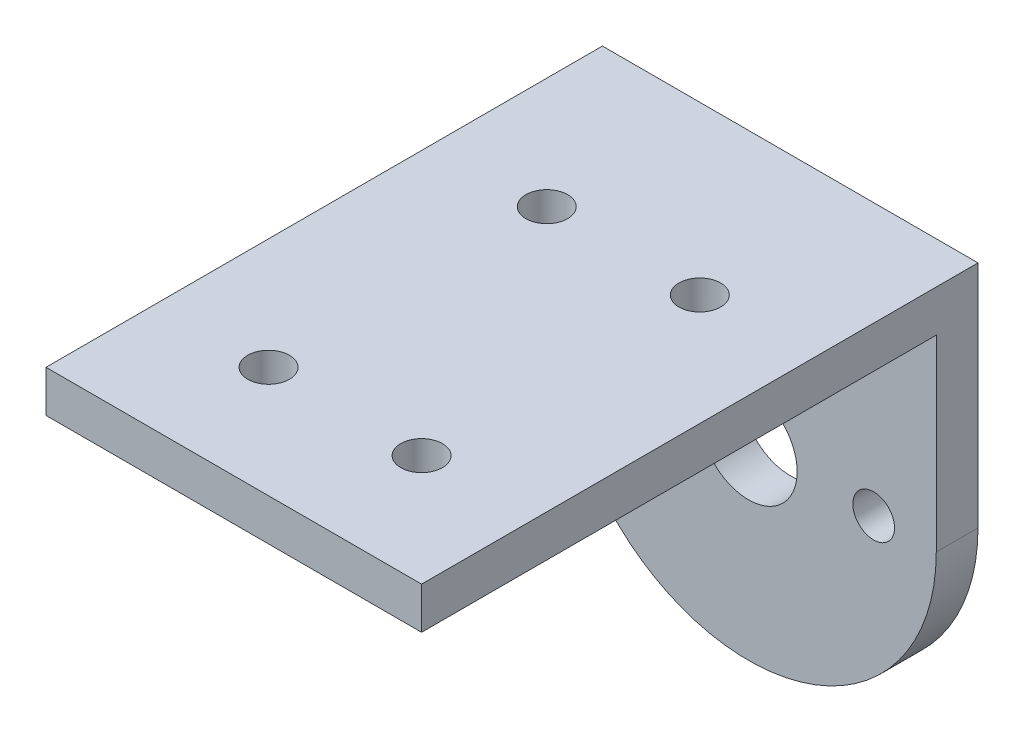
ISO-10303-21;
HEADER;
FILE_DESCRIPTION(('STEP AP214'),'2;1');
FILE_NAME('part.step','',(''),(''),'','','');
FILE_SCHEMA(('AUTOMOTIVE_DESIGN { 1 0 10303 214 1 1 1 1 }'));
ENDSEC;
DATA;
#1=APPLICATION_CONTEXT('core data for automotive mechanical design processes');
#2=APPLICATION_PROTOCOL_DEFINITION('international standard','automotive_design',2000,#1);
#3=PRODUCT_CONTEXT('',#1,'mechanical');
#4=PRODUCT('Part','Part','',(#3));
#5=PRODUCT_RELATED_PRODUCT_CATEGORY('part','',(#4));
#6=PRODUCT_DEFINITION_FORMATION('','',#4);
#7=PRODUCT_DEFINITION_CONTEXT('part definition',#1,'design');
#8=PRODUCT_DEFINITION('design','',#6,#7);
#9=PRODUCT_DEFINITION_SHAPE('','',#8);
#10=(LENGTH_UNIT() NAMED_UNIT(*) SI_UNIT(.MILLI.,.METRE.));
#11=(NAMED_UNIT(*) PLANE_ANGLE_UNIT() SI_UNIT($,.RADIAN.));
#12=(NAMED_UNIT(*) SI_UNIT($,.STERADIAN.) SOLID_ANGLE_UNIT());
#13=UNCERTAINTY_MEASURE_WITH_UNIT(LENGTH_MEASURE(1.E-05),#10,'distance_accuracy_value','');
#14=(GEOMETRIC_REPRESENTATION_CONTEXT(3) GLOBAL_UNCERTAINTY_ASSIGNED_CONTEXT((#13)) GLOBAL_UNIT_ASSIGNED_CONTEXT((#10,
#11,#12)) REPRESENTATION_CONTEXT('',''));
#15=CARTESIAN_POINT('',(0.,0.,0.));
#16=DIRECTION('',(0.,0.,1.));
#17=DIRECTION('',(1.,0.,0.));
#18=AXIS2_PLACEMENT_3D('',#15,#16,#17);
#19=CARTESIAN_POINT('',(2606.26671450499,1592.8264256332,40.));
#20=DIRECTION('',(0.,0.,1.));
#21=DIRECTION('',(1.,0.,0.));
#22=AXIS2_PLACEMENT_3D('',#19,#20,#21);
#23=PLANE('',#22);
#24=DIRECTION('',(1.,0.,0.));
#25=VECTOR('',#24,1.);
#26=CARTESIAN_POINT('',(2582.98867960901,1606.3264256332,40.));
#27=LINE('',#26,#25);
#28=CARTESIAN_POINT('',(2592.76671450499,1606.3264256332,40.));
#29=VERTEX_POINT('',#28);
#30=CARTESIAN_POINT('',(2619.76671450502,1606.3264256332,40.));
#31=VERTEX_POINT('',#30);
#32=EDGE_CURVE('E133',#29,#31,#27,.T.);
#33=ORIENTED_EDGE('',*,*,#32,.T.);
#34=DIRECTION('',(0.,1.,0.));
#35=VECTOR('',#34,1.);
#36=CARTESIAN_POINT('',(2619.76671450499,1592.8264256332,40.));
#37=LINE('',#36,#35);
#38=CARTESIAN_POINT('',(2619.76671450499,1609.3264256332,40.));
#39=VERTEX_POINT('',#38);
#40=EDGE_CURVE('E109',#31,#39,#37,.T.);
#41=ORIENTED_EDGE('',*,*,#40,.T.);
#42=DIRECTION('',(-1.,0.,0.));
#43=VECTOR('',#42,1.);
#44=CARTESIAN_POINT('',(2592.76671450499,1609.3264256332,40.));
#45=LINE('',#44,#43);
#46=CARTESIAN_POINT('',(2592.76671450499,1609.3264256332,40.));
#47=VERTEX_POINT('',#46);
#48=EDGE_CURVE('E69',#39,#47,#45,.T.);
#49=ORIENTED_EDGE('',*,*,#48,.T.);
#50=DIRECTION('',(0.,-1.,0.));
#51=VECTOR('',#50,1.);
#52=CARTESIAN_POINT('',(2592.76671450499,1592.8264256332,40.));
#53=LINE('',#52,#51);
#54=EDGE_CURVE('E100',#47,#29,#53,.T.);
#55=ORIENTED_EDGE('',*,*,#54,.T.);
#56=EDGE_LOOP('',(#33,#41,#49,#55));
#57=FACE_BOUND('',#56,.T.);
#58=ADVANCED_FACE('F43',(#57),#23,.T.);
#59=CARTESIAN_POINT('',(2606.26671450499,1592.8264256332,0.));
#60=DIRECTION('',(0.,0.,1.));
#61=DIRECTION('',(1.,0.,0.));
#62=AXIS2_PLACEMENT_3D('',#59,#60,#61);
#63=PLANE('',#62);
#64=CARTESIAN_POINT('',(2597.26671450499,1592.8264256332,0.));
#65=DIRECTION('',(0.,0.,-1.));
#66=DIRECTION('',(-1.,0.,0.));
#67=AXIS2_PLACEMENT_3D('',#64,#65,#66);
#68=CIRCLE('',#67,1.50000000000011);
#69=CARTESIAN_POINT('',(2595.76671450499,1592.8264256332,0.));
#70=VERTEX_POINT('',#69);
#71=EDGE_CURVE('E153',#70,#70,#68,.T.);
#72=ORIENTED_EDGE('',*,*,#71,.F.);
#73=EDGE_LOOP('',(#72));
#74=FACE_BOUND('',#73,.T.);
#75=CARTESIAN_POINT('',(2615.26671450499,1592.8264256332,0.));
#76=DIRECTION('',(0.,0.,-1.));
#77=DIRECTION('',(-1.,0.,0.));
#78=AXIS2_PLACEMENT_3D('',#75,#76,#77);
#79=CIRCLE('',#78,1.50000000000011);
#80=CARTESIAN_POINT('',(2613.76671450499,1592.8264256332,0.));
#81=VERTEX_POINT('',#80);
#82=EDGE_CURVE('E158',#81,#81,#79,.T.);
#83=ORIENTED_EDGE('',*,*,#82,.F.);
#84=EDGE_LOOP('',(#83));
#85=FACE_BOUND('',#84,.T.);
#86=CARTESIAN_POINT('',(2606.26671450499,1592.8264256332,0.));
#87=DIRECTION('',(0.,0.,1.));
#88=DIRECTION('',(1.,0.,0.));
#89=AXIS2_PLACEMENT_3D('',#86,#87,#88);
#90=CIRCLE('',#89,13.5000000000001);
#91=CARTESIAN_POINT('',(2592.76671450499,1592.8264256332,0.));
#92=VERTEX_POINT('',#91);
#93=CARTESIAN_POINT('',(2619.76671450499,1592.8264256332,0.));
#94=VERTEX_POINT('',#93);
#95=EDGE_CURVE('E93',#92,#94,#90,.T.);
#96=ORIENTED_EDGE('',*,*,#95,.F.);
#97=DIRECTION('',(0.,-1.,0.));
#98=VECTOR('',#97,1.);
#99=CARTESIAN_POINT('',(2592.76671450499,1592.8264256332,0.));
#100=LINE('',#99,#98);
#101=CARTESIAN_POINT('',(2592.76671450499,1609.3264256332,0.));
#102=VERTEX_POINT('',#101);
#103=EDGE_CURVE('E104',#102,#92,#100,.T.);
#104=ORIENTED_EDGE('',*,*,#103,.F.);
#105=DIRECTION('',(-1.,0.,0.));
#106=VECTOR('',#105,1.);
#107=CARTESIAN_POINT('',(2592.76671450499,1609.3264256332,0.));
#108=LINE('',#107,#106);
#109=CARTESIAN_POINT('',(2619.76671450499,1609.3264256332,0.));
#110=VERTEX_POINT('',#109);
#111=EDGE_CURVE('E110',#110,#102,#108,.T.);
#112=ORIENTED_EDGE('',*,*,#111,.F.);
#113=DIRECTION('',(0.,1.,0.));
#114=VECTOR('',#113,1.);
#115=CARTESIAN_POINT('',(2619.76671450499,1592.8264256332,0.));
#116=LINE('',#115,#114);
#117=EDGE_CURVE('E115',#94,#110,#116,.T.);
#118=ORIENTED_EDGE('',*,*,#117,.F.);
#119=EDGE_LOOP('',(#96,#104,#112,#118));
#120=FACE_BOUND('',#119,.T.);
#121=CARTESIAN_POINT('',(2606.26671450499,1592.8264256332,0.));
#122=DIRECTION('',(0.,0.,1.));
#123=DIRECTION('',(1.,0.,0.));
#124=AXIS2_PLACEMENT_3D('',#121,#122,#123);
#125=CIRCLE('',#124,3.49999999999984);
#126=CARTESIAN_POINT('',(2609.76671450499,1592.8264256332,0.));
#127=VERTEX_POINT('',#126);
#128=EDGE_CURVE('E116',#127,#127,#125,.T.);
#129=ORIENTED_EDGE('',*,*,#128,.T.);
#130=EDGE_LOOP('',(#129));
#131=FACE_BOUND('',#130,.T.);
#132=ADVANCED_FACE('F113',(#74,#85,#120,#131),#63,.F.);
#133=CARTESIAN_POINT('',(2606.26671450499,1592.8264256332,40.));
#134=DIRECTION('',(0.,0.,-1.));
#135=DIRECTION('',(-1.,0.,0.));
#136=AXIS2_PLACEMENT_3D('',#133,#134,#135);
#137=CYLINDRICAL_SURFACE('',#136,13.5000000000001);
#138=DIRECTION('',(0.,0.,-1.));
#139=VECTOR('',#138,1.);
#140=CARTESIAN_POINT('',(2619.76671450499,1592.8264256332,40.));
#141=LINE('',#140,#139);
#142=CARTESIAN_POINT('',(2619.76671450502,1592.8264256332,3.));
#143=VERTEX_POINT('',#142);
#144=EDGE_CURVE('E52',#143,#94,#141,.T.);
#145=ORIENTED_EDGE('',*,*,#144,.F.);
#146=CARTESIAN_POINT('',(2606.26671450499,1592.8264256332,3.));
#147=DIRECTION('',(0.,0.,-1.));
#148=DIRECTION('',(0.,1.,0.));
#149=AXIS2_PLACEMENT_3D('',#146,#147,#148);
#150=CIRCLE('',#149,13.5000000000001);
#151=CARTESIAN_POINT('',(2592.76671450499,1592.8264256332,3.));
#152=VERTEX_POINT('',#151);
#153=EDGE_CURVE('E96',#143,#152,#150,.T.);
#154=ORIENTED_EDGE('',*,*,#153,.T.);
#155=DIRECTION('',(0.,0.,-1.));
#156=VECTOR('',#155,1.);
#157=CARTESIAN_POINT('',(2592.76671450499,1592.8264256332,40.));
#158=LINE('',#157,#156);
#159=EDGE_CURVE('E89',#152,#92,#158,.T.);
#160=ORIENTED_EDGE('',*,*,#159,.T.);
#161=ORIENTED_EDGE('',*,*,#95,.T.);
#162=EDGE_LOOP('',(#145,#154,#160,#161));
#163=FACE_BOUND('',#162,.T.);
#164=ADVANCED_FACE('F45',(#163),#137,.T.);
#165=CARTESIAN_POINT('',(2619.76671450499,1592.8264256332,40.));
#166=DIRECTION('',(-1.,0.,0.));
#167=DIRECTION('',(0.,0.,1.));
#168=AXIS2_PLACEMENT_3D('',#165,#166,#167);
#169=PLANE('',#168);
#170=ORIENTED_EDGE('',*,*,#40,.F.);
#171=DIRECTION('',(0.,0.,1.));
#172=VECTOR('',#171,1.);
#173=CARTESIAN_POINT('',(2619.76671450502,1606.3264256332,40.));
#174=LINE('',#173,#172);
#175=CARTESIAN_POINT('',(2619.76671450502,1606.3264256332,3.));
#176=VERTEX_POINT('',#175);
#177=EDGE_CURVE('E174',#176,#31,#174,.T.);
#178=ORIENTED_EDGE('',*,*,#177,.F.);
#179=DIRECTION('',(0.,1.,0.));
#180=VECTOR('',#179,1.);
#181=CARTESIAN_POINT('',(2619.76671450502,1606.3264256332,3.));
#182=LINE('',#181,#180);
#183=EDGE_CURVE('E138',#143,#176,#182,.T.);
#184=ORIENTED_EDGE('',*,*,#183,.F.);
#185=ORIENTED_EDGE('',*,*,#144,.T.);
#186=ORIENTED_EDGE('',*,*,#117,.T.);
#187=DIRECTION('',(0.,0.,-1.));
#188=VECTOR('',#187,1.);
#189=CARTESIAN_POINT('',(2619.76671450499,1609.3264256332,40.));
#190=LINE('',#189,#188);
#191=EDGE_CURVE('E126',#39,#110,#190,.T.);
#192=ORIENTED_EDGE('',*,*,#191,.F.);
#193=EDGE_LOOP('',(#170,#178,#184,#185,#186,#192));
#194=FACE_BOUND('',#193,.T.);
#195=ADVANCED_FACE('F193',(#194),#169,.F.);
#196=CARTESIAN_POINT('',(2592.76671450499,1609.3264256332,40.));
#197=DIRECTION('',(0.,-1.,0.));
#198=DIRECTION('',(0.,0.,-1.));
#199=AXIS2_PLACEMENT_3D('',#196,#197,#198);
#200=PLANE('',#199);
#201=CARTESIAN_POINT('',(2600.76671450499,1609.3264256332,12.));
#202=DIRECTION('',(0.,1.,0.));
#203=DIRECTION('',(0.,0.,1.));
#204=AXIS2_PLACEMENT_3D('',#201,#202,#203);
#205=CIRCLE('',#204,1.50000000000008);
#206=CARTESIAN_POINT('',(2600.76671450499,1609.3264256332,13.5000000000001));
#207=VERTEX_POINT('',#206);
#208=EDGE_CURVE('E150',#207,#207,#205,.T.);
#209=ORIENTED_EDGE('',*,*,#208,.F.);
#210=EDGE_LOOP('',(#209));
#211=FACE_BOUND('',#210,.T.);
#212=CARTESIAN_POINT('',(2611.76671450499,1609.3264256332,12.));
#213=DIRECTION('',(0.,1.,0.));
#214=DIRECTION('',(0.,0.,1.));
#215=AXIS2_PLACEMENT_3D('',#212,#213,#214);
#216=CIRCLE('',#215,1.50000000000008);
#217=CARTESIAN_POINT('',(2611.76671450499,1609.3264256332,13.5000000000001));
#218=VERTEX_POINT('',#217);
#219=EDGE_CURVE('E147',#218,#218,#216,.T.);
#220=ORIENTED_EDGE('',*,*,#219,.F.);
#221=EDGE_LOOP('',(#220));
#222=FACE_BOUND('',#221,.T.);
#223=CARTESIAN_POINT('',(2611.76671450499,1609.3264256332,32.));
#224=DIRECTION('',(0.,1.,0.));
#225=DIRECTION('',(0.,0.,1.));
#226=AXIS2_PLACEMENT_3D('',#223,#224,#225);
#227=CIRCLE('',#226,1.50000000000008);
#228=CARTESIAN_POINT('',(2611.76671450499,1609.3264256332,33.5000000000001));
#229=VERTEX_POINT('',#228);
#230=EDGE_CURVE('E143',#229,#229,#227,.T.);
#231=ORIENTED_EDGE('',*,*,#230,.F.);
#232=EDGE_LOOP('',(#231));
#233=FACE_BOUND('',#232,.T.);
#234=CARTESIAN_POINT('',(2600.76671450499,1609.3264256332,32.));
#235=DIRECTION('',(0.,1.,0.));
#236=DIRECTION('',(0.,0.,1.));
#237=AXIS2_PLACEMENT_3D('',#234,#235,#236);
#238=CIRCLE('',#237,1.50000000000008);
#239=CARTESIAN_POINT('',(2600.76671450499,1609.3264256332,33.5000000000001));
#240=VERTEX_POINT('',#239);
#241=EDGE_CURVE('E139',#240,#240,#238,.T.);
#242=ORIENTED_EDGE('',*,*,#241,.F.);
#243=EDGE_LOOP('',(#242));
#244=FACE_BOUND('',#243,.T.);
#245=ORIENTED_EDGE('',*,*,#111,.T.);
#246=DIRECTION('',(0.,0.,-1.));
#247=VECTOR('',#246,1.);
#248=CARTESIAN_POINT('',(2592.76671450499,1609.3264256332,40.));
#249=LINE('',#248,#247);
#250=EDGE_CURVE('E99',#47,#102,#249,.T.);
#251=ORIENTED_EDGE('',*,*,#250,.F.);
#252=ORIENTED_EDGE('',*,*,#48,.F.);
#253=ORIENTED_EDGE('',*,*,#191,.T.);
#254=EDGE_LOOP('',(#245,#251,#252,#253));
#255=FACE_BOUND('',#254,.T.);
#256=ADVANCED_FACE('F226',(#211,#222,#233,#244,#255),#200,.F.);
#257=CARTESIAN_POINT('',(2592.76671450499,1592.8264256332,40.));
#258=DIRECTION('',(1.,0.,0.));
#259=DIRECTION('',(0.,0.,-1.));
#260=AXIS2_PLACEMENT_3D('',#257,#258,#259);
#261=PLANE('',#260);
#262=DIRECTION('',(0.,1.,0.));
#263=VECTOR('',#262,1.);
#264=CARTESIAN_POINT('',(2592.76671450499,1592.8264256332,3.));
#265=LINE('',#264,#263);
#266=CARTESIAN_POINT('',(2592.76671450499,1606.3264256332,3.));
#267=VERTEX_POINT('',#266);
#268=EDGE_CURVE('E132',#152,#267,#265,.T.);
#269=ORIENTED_EDGE('',*,*,#268,.T.);
#270=DIRECTION('',(0.,0.,1.));
#271=VECTOR('',#270,1.);
#272=CARTESIAN_POINT('',(2592.76671450499,1606.3264256332,40.));
#273=LINE('',#272,#271);
#274=EDGE_CURVE('E11',#267,#29,#273,.T.);
#275=ORIENTED_EDGE('',*,*,#274,.T.);
#276=ORIENTED_EDGE('',*,*,#54,.F.);
#277=ORIENTED_EDGE('',*,*,#250,.T.);
#278=ORIENTED_EDGE('',*,*,#103,.T.);
#279=ORIENTED_EDGE('',*,*,#159,.F.);
#280=EDGE_LOOP('',(#269,#275,#276,#277,#278,#279));
#281=FACE_BOUND('',#280,.T.);
#282=ADVANCED_FACE('F105',(#281),#261,.F.);
#283=CARTESIAN_POINT('',(2606.26671450499,1592.8264256332,40.));
#284=DIRECTION('',(0.,0.,-1.));
#285=DIRECTION('',(-1.,0.,0.));
#286=AXIS2_PLACEMENT_3D('',#283,#284,#285);
#287=CYLINDRICAL_SURFACE('',#286,3.49999999999984);
#288=CARTESIAN_POINT('',(2606.26671450499,1592.8264256332,3.));
#289=DIRECTION('',(0.,0.,-1.));
#290=DIRECTION('',(0.,1.,0.));
#291=AXIS2_PLACEMENT_3D('',#288,#289,#290);
#292=CIRCLE('',#291,3.49999999999984);
#293=CARTESIAN_POINT('',(2606.26671450499,1596.3264256332,3.));
#294=VERTEX_POINT('',#293);
#295=EDGE_CURVE('E130',#294,#294,#292,.T.);
#296=ORIENTED_EDGE('',*,*,#295,.F.);
#297=EDGE_LOOP('',(#296));
#298=FACE_BOUND('',#297,.T.);
#299=ORIENTED_EDGE('',*,*,#128,.F.);
#300=EDGE_LOOP('',(#299));
#301=FACE_BOUND('',#300,.T.);
#302=ADVANCED_FACE('F212',(#298,#301),#287,.F.);
#303=CARTESIAN_POINT('',(2582.98867960901,1606.3264256332,40.));
#304=DIRECTION('',(0.,1.,0.));
#305=DIRECTION('',(-1.,0.,0.));
#306=AXIS2_PLACEMENT_3D('',#303,#304,#305);
#307=PLANE('',#306);
#308=CARTESIAN_POINT('',(2600.76671450499,1606.3264256332,12.));
#309=DIRECTION('',(0.,1.,0.));
#310=DIRECTION('',(-1.,0.,0.));
#311=AXIS2_PLACEMENT_3D('',#308,#309,#310);
#312=CIRCLE('',#311,1.50000000000008);
#313=CARTESIAN_POINT('',(2599.26671450499,1606.3264256332,12.));
#314=VERTEX_POINT('',#313);
#315=EDGE_CURVE('E148',#314,#314,#312,.T.);
#316=ORIENTED_EDGE('',*,*,#315,.T.);
#317=EDGE_LOOP('',(#316));
#318=FACE_BOUND('',#317,.T.);
#319=CARTESIAN_POINT('',(2611.76671450499,1606.3264256332,12.));
#320=DIRECTION('',(0.,1.,0.));
#321=DIRECTION('',(-1.,0.,0.));
#322=AXIS2_PLACEMENT_3D('',#319,#320,#321);
#323=CIRCLE('',#322,1.50000000000008);
#324=CARTESIAN_POINT('',(2610.26671450499,1606.3264256332,12.));
#325=VERTEX_POINT('',#324);
#326=EDGE_CURVE('E144',#325,#325,#323,.T.);
#327=ORIENTED_EDGE('',*,*,#326,.T.);
#328=EDGE_LOOP('',(#327));
#329=FACE_BOUND('',#328,.T.);
#330=CARTESIAN_POINT('',(2611.76671450499,1606.3264256332,32.));
#331=DIRECTION('',(0.,1.,0.));
#332=DIRECTION('',(-1.,0.,0.));
#333=AXIS2_PLACEMENT_3D('',#330,#331,#332);
#334=CIRCLE('',#333,1.50000000000008);
#335=CARTESIAN_POINT('',(2610.26671450499,1606.3264256332,32.));
#336=VERTEX_POINT('',#335);
#337=EDGE_CURVE('E140',#336,#336,#334,.T.);
#338=ORIENTED_EDGE('',*,*,#337,.T.);
#339=EDGE_LOOP('',(#338));
#340=FACE_BOUND('',#339,.T.);
#341=CARTESIAN_POINT('',(2600.76671450499,1606.3264256332,32.));
#342=DIRECTION('',(0.,1.,0.));
#343=DIRECTION('',(-1.,0.,0.));
#344=AXIS2_PLACEMENT_3D('',#341,#342,#343);
#345=CIRCLE('',#344,1.50000000000008);
#346=CARTESIAN_POINT('',(2599.26671450499,1606.3264256332,32.));
#347=VERTEX_POINT('',#346);
#348=EDGE_CURVE('E135',#347,#347,#345,.T.);
#349=ORIENTED_EDGE('',*,*,#348,.T.);
#350=EDGE_LOOP('',(#349));
#351=FACE_BOUND('',#350,.T.);
#352=DIRECTION('',(1.,0.,0.));
#353=VECTOR('',#352,1.);
#354=CARTESIAN_POINT('',(2582.98867960901,1606.3264256332,3.));
#355=LINE('',#354,#353);
#356=EDGE_CURVE('E60',#267,#176,#355,.T.);
#357=ORIENTED_EDGE('',*,*,#356,.T.);
#358=ORIENTED_EDGE('',*,*,#177,.T.);
#359=ORIENTED_EDGE('',*,*,#32,.F.);
#360=ORIENTED_EDGE('',*,*,#274,.F.);
#361=EDGE_LOOP('',(#357,#358,#359,#360));
#362=FACE_BOUND('',#361,.T.);
#363=ADVANCED_FACE('F186',(#318,#329,#340,#351,#362),#307,.F.);
#364=CARTESIAN_POINT('',(2582.98867960901,1606.3264256332,3.));
#365=DIRECTION('',(0.,0.,-1.));
#366=DIRECTION('',(0.,1.,0.));
#367=AXIS2_PLACEMENT_3D('',#364,#365,#366);
#368=PLANE('',#367);
#369=CARTESIAN_POINT('',(2597.26671450499,1592.8264256332,3.));
#370=DIRECTION('',(0.,0.,-1.));
#371=DIRECTION('',(0.,1.,0.));
#372=AXIS2_PLACEMENT_3D('',#369,#370,#371);
#373=CIRCLE('',#372,1.50000000000011);
#374=CARTESIAN_POINT('',(2597.26671450499,1594.3264256332,3.));
#375=VERTEX_POINT('',#374);
#376=EDGE_CURVE('E47',#375,#375,#373,.T.);
#377=ORIENTED_EDGE('',*,*,#376,.T.);
#378=EDGE_LOOP('',(#377));
#379=FACE_BOUND('',#378,.T.);
#380=CARTESIAN_POINT('',(2615.26671450499,1592.8264256332,3.));
#381=DIRECTION('',(0.,0.,-1.));
#382=DIRECTION('',(0.,1.,0.));
#383=AXIS2_PLACEMENT_3D('',#380,#381,#382);
#384=CIRCLE('',#383,1.50000000000011);
#385=CARTESIAN_POINT('',(2615.26671450499,1594.3264256332,3.));
#386=VERTEX_POINT('',#385);
#387=EDGE_CURVE('E151',#386,#386,#384,.T.);
#388=ORIENTED_EDGE('',*,*,#387,.T.);
#389=EDGE_LOOP('',(#388));
#390=FACE_BOUND('',#389,.T.);
#391=ORIENTED_EDGE('',*,*,#295,.T.);
#392=EDGE_LOOP('',(#391));
#393=FACE_BOUND('',#392,.T.);
#394=ORIENTED_EDGE('',*,*,#183,.T.);
#395=ORIENTED_EDGE('',*,*,#356,.F.);
#396=ORIENTED_EDGE('',*,*,#268,.F.);
#397=ORIENTED_EDGE('',*,*,#153,.F.);
#398=EDGE_LOOP('',(#394,#395,#396,#397));
#399=FACE_BOUND('',#398,.T.);
#400=ADVANCED_FACE('F198',(#379,#390,#393,#399),#368,.F.);
#401=CARTESIAN_POINT('',(2600.76671450499,1569.3264256332,32.));
#402=DIRECTION('',(0.,1.,0.));
#403=DIRECTION('',(0.,0.,1.));
#404=AXIS2_PLACEMENT_3D('',#401,#402,#403);
#405=CYLINDRICAL_SURFACE('',#404,1.50000000000008);
#406=ORIENTED_EDGE('',*,*,#241,.T.);
#407=EDGE_LOOP('',(#406));
#408=FACE_BOUND('',#407,.T.);
#409=ORIENTED_EDGE('',*,*,#348,.F.);
#410=EDGE_LOOP('',(#409));
#411=FACE_BOUND('',#410,.T.);
#412=ADVANCED_FACE('F200',(#408,#411),#405,.F.);
#413=CARTESIAN_POINT('',(2611.76671450499,1569.3264256332,32.));
#414=DIRECTION('',(0.,1.,0.));
#415=DIRECTION('',(0.,0.,1.));
#416=AXIS2_PLACEMENT_3D('',#413,#414,#415);
#417=CYLINDRICAL_SURFACE('',#416,1.50000000000008);
#418=ORIENTED_EDGE('',*,*,#230,.T.);
#419=EDGE_LOOP('',(#418));
#420=FACE_BOUND('',#419,.T.);
#421=ORIENTED_EDGE('',*,*,#337,.F.);
#422=EDGE_LOOP('',(#421));
#423=FACE_BOUND('',#422,.T.);
#424=ADVANCED_FACE('F208',(#420,#423),#417,.F.);
#425=CARTESIAN_POINT('',(2611.76671450499,1569.3264256332,12.));
#426=DIRECTION('',(0.,1.,0.));
#427=DIRECTION('',(0.,0.,1.));
#428=AXIS2_PLACEMENT_3D('',#425,#426,#427);
#429=CYLINDRICAL_SURFACE('',#428,1.50000000000008);
#430=ORIENTED_EDGE('',*,*,#219,.T.);
#431=EDGE_LOOP('',(#430));
#432=FACE_BOUND('',#431,.T.);
#433=ORIENTED_EDGE('',*,*,#326,.F.);
#434=EDGE_LOOP('',(#433));
#435=FACE_BOUND('',#434,.T.);
#436=ADVANCED_FACE('F277',(#432,#435),#429,.F.);
#437=CARTESIAN_POINT('',(2600.76671450499,1569.3264256332,12.));
#438=DIRECTION('',(0.,1.,0.));
#439=DIRECTION('',(0.,0.,1.));
#440=AXIS2_PLACEMENT_3D('',#437,#438,#439);
#441=CYLINDRICAL_SURFACE('',#440,1.50000000000008);
#442=ORIENTED_EDGE('',*,*,#208,.T.);
#443=EDGE_LOOP('',(#442));
#444=FACE_BOUND('',#443,.T.);
#445=ORIENTED_EDGE('',*,*,#315,.F.);
#446=EDGE_LOOP('',(#445));
#447=FACE_BOUND('',#446,.T.);
#448=ADVANCED_FACE('F287',(#444,#447),#441,.F.);
#449=CARTESIAN_POINT('',(2615.26671450499,1592.8264256332,28.9999999999999));
#450=DIRECTION('',(0.,0.,-1.));
#451=DIRECTION('',(-1.,0.,0.));
#452=AXIS2_PLACEMENT_3D('',#449,#450,#451);
#453=CYLINDRICAL_SURFACE('',#452,1.50000000000011);
#454=ORIENTED_EDGE('',*,*,#82,.T.);
#455=EDGE_LOOP('',(#454));
#456=FACE_BOUND('',#455,.T.);
#457=ORIENTED_EDGE('',*,*,#387,.F.);
#458=EDGE_LOOP('',(#457));
#459=FACE_BOUND('',#458,.T.);
#460=ADVANCED_FACE('F297',(#456,#459),#453,.F.);
#461=CARTESIAN_POINT('',(2597.26671450499,1592.8264256332,28.9999999999999));
#462=DIRECTION('',(0.,0.,-1.));
#463=DIRECTION('',(-1.,0.,0.));
#464=AXIS2_PLACEMENT_3D('',#461,#462,#463);
#465=CYLINDRICAL_SURFACE('',#464,1.50000000000011);
#466=ORIENTED_EDGE('',*,*,#71,.T.);
#467=EDGE_LOOP('',(#466));
#468=FACE_BOUND('',#467,.T.);
#469=ORIENTED_EDGE('',*,*,#376,.F.);
#470=EDGE_LOOP('',(#469));
#471=FACE_BOUND('',#470,.T.);
#472=ADVANCED_FACE('F306',(#468,#471),#465,.F.);
#473=CLOSED_SHELL('',(#58,#132,#164,#195,#256,#282,#302,#363,#400,#412,#424,#436,#448,#460,#472));
#474=MANIFOLD_SOLID_BREP('B2',#473);
#475=ADVANCED_BREP_SHAPE_REPRESENTATION('',(#18,#474),#14);
#476=SHAPE_DEFINITION_REPRESENTATION(#9,#475);
ENDSEC;
END-ISO-10303-21;
